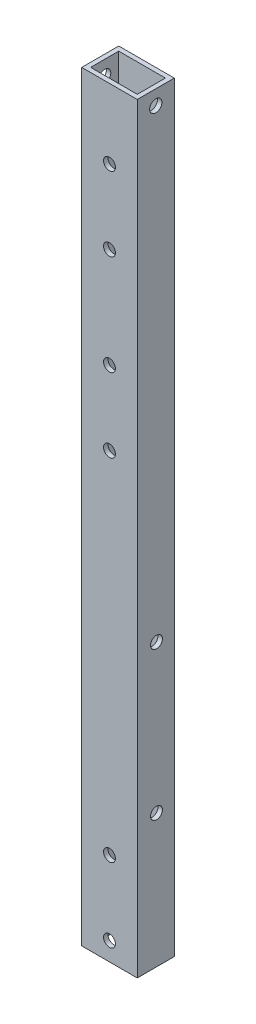
ISO-10303-21;
HEADER;
FILE_DESCRIPTION(('STEP AP214'),'2;1');
FILE_NAME('part.step','',(''),(''),'','','');
FILE_SCHEMA(('AUTOMOTIVE_DESIGN { 1 0 10303 214 1 1 1 1 }'));
ENDSEC;
DATA;
#1=APPLICATION_CONTEXT('core data for automotive mechanical design processes');
#2=APPLICATION_PROTOCOL_DEFINITION('international standard','automotive_design',2000,#1);
#3=PRODUCT_CONTEXT('',#1,'mechanical');
#4=PRODUCT('Part','Part','',(#3));
#5=PRODUCT_RELATED_PRODUCT_CATEGORY('part','',(#4));
#6=PRODUCT_DEFINITION_FORMATION('','',#4);
#7=PRODUCT_DEFINITION_CONTEXT('part definition',#1,'design');
#8=PRODUCT_DEFINITION('design','',#6,#7);
#9=PRODUCT_DEFINITION_SHAPE('','',#8);
#10=(LENGTH_UNIT() NAMED_UNIT(*) SI_UNIT(.MILLI.,.METRE.));
#11=(NAMED_UNIT(*) PLANE_ANGLE_UNIT() SI_UNIT($,.RADIAN.));
#12=(NAMED_UNIT(*) SI_UNIT($,.STERADIAN.) SOLID_ANGLE_UNIT());
#13=UNCERTAINTY_MEASURE_WITH_UNIT(LENGTH_MEASURE(1.E-05),#10,'distance_accuracy_value','');
#14=(GEOMETRIC_REPRESENTATION_CONTEXT(3) GLOBAL_UNCERTAINTY_ASSIGNED_CONTEXT((#13)) GLOBAL_UNIT_ASSIGNED_CONTEXT((#10,
#11,#12)) REPRESENTATION_CONTEXT('',''));
#15=CARTESIAN_POINT('',(0.,0.,0.));
#16=DIRECTION('',(0.,0.,1.));
#17=DIRECTION('',(1.,0.,0.));
#18=AXIS2_PLACEMENT_3D('',#15,#16,#17);
#19=CARTESIAN_POINT('',(7.5,110.,-5.));
#20=DIRECTION('',(-1.,0.,0.));
#21=DIRECTION('',(0.,0.,1.));
#22=AXIS2_PLACEMENT_3D('',#19,#20,#21);
#23=PLANE('',#22);
#24=CARTESIAN_POINT('',(7.5,91.5,0.));
#25=DIRECTION('',(-1.,0.,0.));
#26=DIRECTION('',(0.,0.,1.));
#27=AXIS2_PLACEMENT_3D('',#24,#25,#26);
#28=CIRCLE('',#27,1.65);
#29=CARTESIAN_POINT('',(7.5,91.5,1.64999999999995));
#30=VERTEX_POINT('',#29);
#31=EDGE_CURVE('E184',#30,#30,#28,.T.);
#32=ORIENTED_EDGE('',*,*,#31,.T.);
#33=EDGE_LOOP('',(#32));
#34=FACE_BOUND('',#33,.T.);
#35=CARTESIAN_POINT('',(7.5,-34.,-0.200000000000043));
#36=DIRECTION('',(-1.,0.,0.));
#37=DIRECTION('',(0.,0.,1.));
#38=AXIS2_PLACEMENT_3D('',#35,#36,#37);
#39=CIRCLE('',#38,1.6);
#40=CARTESIAN_POINT('',(7.5,-34.,1.39999999999995));
#41=VERTEX_POINT('',#40);
#42=EDGE_CURVE('E268',#41,#41,#39,.T.);
#43=ORIENTED_EDGE('',*,*,#42,.T.);
#44=EDGE_LOOP('',(#43));
#45=FACE_BOUND('',#44,.T.);
#46=CARTESIAN_POINT('',(7.5,-74.,-0.20000000000002));
#47=DIRECTION('',(-1.,0.,0.));
#48=DIRECTION('',(0.,0.,1.));
#49=AXIS2_PLACEMENT_3D('',#46,#47,#48);
#50=CIRCLE('',#49,1.60000000000001);
#51=CARTESIAN_POINT('',(7.5,-74.,1.39999999999999));
#52=VERTEX_POINT('',#51);
#53=EDGE_CURVE('E162',#52,#52,#50,.T.);
#54=ORIENTED_EDGE('',*,*,#53,.T.);
#55=EDGE_LOOP('',(#54));
#56=FACE_BOUND('',#55,.T.);
#57=DIRECTION('',(0.,0.,-1.));
#58=VECTOR('',#57,1.);
#59=CARTESIAN_POINT('',(7.5,95.5,5.));
#60=LINE('',#59,#58);
#61=CARTESIAN_POINT('',(7.5,95.5,5.));
#62=VERTEX_POINT('',#61);
#63=CARTESIAN_POINT('',(7.5,95.5,-5.));
#64=VERTEX_POINT('',#63);
#65=EDGE_CURVE('E110',#62,#64,#60,.T.);
#66=ORIENTED_EDGE('',*,*,#65,.F.);
#67=DIRECTION('',(0.,-1.,0.));
#68=VECTOR('',#67,1.);
#69=CARTESIAN_POINT('',(7.5,110.,5.));
#70=LINE('',#69,#68);
#71=CARTESIAN_POINT('',(7.5,-110.,5.));
#72=VERTEX_POINT('',#71);
#73=EDGE_CURVE('E121',#62,#72,#70,.T.);
#74=ORIENTED_EDGE('',*,*,#73,.T.);
#75=DIRECTION('',(0.,0.,-1.));
#76=VECTOR('',#75,1.);
#77=CARTESIAN_POINT('',(7.5,-110.,-5.));
#78=LINE('',#77,#76);
#79=CARTESIAN_POINT('',(7.5,-110.,-5.));
#80=VERTEX_POINT('',#79);
#81=EDGE_CURVE('E329',#72,#80,#78,.T.);
#82=ORIENTED_EDGE('',*,*,#81,.T.);
#83=DIRECTION('',(0.,-1.,0.));
#84=VECTOR('',#83,1.);
#85=CARTESIAN_POINT('',(7.5,110.,-5.));
#86=LINE('',#85,#84);
#87=EDGE_CURVE('E53',#64,#80,#86,.T.);
#88=ORIENTED_EDGE('',*,*,#87,.F.);
#89=EDGE_LOOP('',(#66,#74,#82,#88));
#90=FACE_BOUND('',#89,.T.);
#91=ADVANCED_FACE('F44',(#34,#45,#56,#90),#23,.F.);
#92=CARTESIAN_POINT('',(-7.5,110.,-5.));
#93=DIRECTION('',(0.,0.,1.));
#94=DIRECTION('',(1.,0.,0.));
#95=AXIS2_PLACEMENT_3D('',#92,#93,#94);
#96=PLANE('',#95);
#97=CARTESIAN_POINT('',(0.,9.60000000000003,-5.));
#98=DIRECTION('',(0.,0.,-1.));
#99=DIRECTION('',(-1.,0.,0.));
#100=AXIS2_PLACEMENT_3D('',#97,#98,#99);
#101=CIRCLE('',#100,1.6);
#102=CARTESIAN_POINT('',(-1.6,9.60000000000003,-5.));
#103=VERTEX_POINT('',#102);
#104=EDGE_CURVE('E197',#103,#103,#101,.T.);
#105=ORIENTED_EDGE('',*,*,#104,.F.);
#106=EDGE_LOOP('',(#105));
#107=FACE_BOUND('',#106,.T.);
#108=CARTESIAN_POINT('',(0.,29.6,-5.));
#109=DIRECTION('',(0.,0.,-1.));
#110=DIRECTION('',(-1.,0.,0.));
#111=AXIS2_PLACEMENT_3D('',#108,#109,#110);
#112=CIRCLE('',#111,1.6);
#113=CARTESIAN_POINT('',(-1.59999999999999,29.6,-5.));
#114=VERTEX_POINT('',#113);
#115=EDGE_CURVE('E203',#114,#114,#112,.T.);
#116=ORIENTED_EDGE('',*,*,#115,.F.);
#117=EDGE_LOOP('',(#116));
#118=FACE_BOUND('',#117,.T.);
#119=CARTESIAN_POINT('',(0.,56.66,-5.));
#120=DIRECTION('',(0.,0.,-1.));
#121=DIRECTION('',(-1.,0.,0.));
#122=AXIS2_PLACEMENT_3D('',#119,#120,#121);
#123=CIRCLE('',#122,1.6);
#124=CARTESIAN_POINT('',(-1.6,56.66,-5.));
#125=VERTEX_POINT('',#124);
#126=EDGE_CURVE('E173',#125,#125,#123,.T.);
#127=ORIENTED_EDGE('',*,*,#126,.F.);
#128=EDGE_LOOP('',(#127));
#129=FACE_BOUND('',#128,.T.);
#130=CARTESIAN_POINT('',(0.,76.66,-5.));
#131=DIRECTION('',(0.,0.,-1.));
#132=DIRECTION('',(-1.,0.,0.));
#133=AXIS2_PLACEMENT_3D('',#130,#131,#132);
#134=CIRCLE('',#133,1.6);
#135=CARTESIAN_POINT('',(-1.6,76.66,-5.));
#136=VERTEX_POINT('',#135);
#137=EDGE_CURVE('E227',#136,#136,#134,.T.);
#138=ORIENTED_EDGE('',*,*,#137,.F.);
#139=EDGE_LOOP('',(#138));
#140=FACE_BOUND('',#139,.T.);
#141=CARTESIAN_POINT('',(0.,-105.,-5.));
#142=DIRECTION('',(0.,0.,-1.));
#143=DIRECTION('',(-1.,0.,0.));
#144=AXIS2_PLACEMENT_3D('',#141,#142,#143);
#145=CIRCLE('',#144,1.60000000000001);
#146=CARTESIAN_POINT('',(-1.60000000000001,-105.,-5.));
#147=VERTEX_POINT('',#146);
#148=EDGE_CURVE('E281',#147,#147,#145,.T.);
#149=ORIENTED_EDGE('',*,*,#148,.F.);
#150=EDGE_LOOP('',(#149));
#151=FACE_BOUND('',#150,.T.);
#152=CARTESIAN_POINT('',(0.,-85.,-5.));
#153=DIRECTION('',(0.,0.,-1.));
#154=DIRECTION('',(-1.,0.,0.));
#155=AXIS2_PLACEMENT_3D('',#152,#153,#154);
#156=CIRCLE('',#155,1.6);
#157=CARTESIAN_POINT('',(-1.6,-85.,-5.));
#158=VERTEX_POINT('',#157);
#159=EDGE_CURVE('E150',#158,#158,#156,.T.);
#160=ORIENTED_EDGE('',*,*,#159,.F.);
#161=EDGE_LOOP('',(#160));
#162=FACE_BOUND('',#161,.T.);
#163=DIRECTION('',(-1.,0.,0.));
#164=VECTOR('',#163,1.);
#165=CARTESIAN_POINT('',(7.5,95.5,-5.));
#166=LINE('',#165,#164);
#167=CARTESIAN_POINT('',(-7.5,95.5,-5.));
#168=VERTEX_POINT('',#167);
#169=EDGE_CURVE('E124',#64,#168,#166,.T.);
#170=ORIENTED_EDGE('',*,*,#169,.F.);
#171=ORIENTED_EDGE('',*,*,#87,.T.);
#172=DIRECTION('',(-1.,0.,0.));
#173=VECTOR('',#172,1.);
#174=CARTESIAN_POINT('',(-7.5,-110.,-5.));
#175=LINE('',#174,#173);
#176=CARTESIAN_POINT('',(-7.5,-110.,-5.));
#177=VERTEX_POINT('',#176);
#178=EDGE_CURVE('E332',#80,#177,#175,.T.);
#179=ORIENTED_EDGE('',*,*,#178,.T.);
#180=DIRECTION('',(0.,-1.,0.));
#181=VECTOR('',#180,1.);
#182=CARTESIAN_POINT('',(-7.5,110.,-5.));
#183=LINE('',#182,#181);
#184=EDGE_CURVE('E135',#168,#177,#183,.T.);
#185=ORIENTED_EDGE('',*,*,#184,.F.);
#186=EDGE_LOOP('',(#170,#171,#179,#185));
#187=FACE_BOUND('',#186,.T.);
#188=ADVANCED_FACE('F346',(#107,#118,#129,#140,#151,#162,#187),#96,.F.);
#189=CARTESIAN_POINT('',(-7.5,110.,-5.));
#190=DIRECTION('',(1.,0.,0.));
#191=DIRECTION('',(0.,0.,-1.));
#192=AXIS2_PLACEMENT_3D('',#189,#190,#191);
#193=PLANE('',#192);
#194=CARTESIAN_POINT('',(-7.5,91.5,0.));
#195=DIRECTION('',(-1.,0.,0.));
#196=DIRECTION('',(0.,0.,1.));
#197=AXIS2_PLACEMENT_3D('',#194,#195,#196);
#198=CIRCLE('',#197,1.65);
#199=CARTESIAN_POINT('',(-7.5,91.5,1.64999999999995));
#200=VERTEX_POINT('',#199);
#201=EDGE_CURVE('E217',#200,#200,#198,.T.);
#202=ORIENTED_EDGE('',*,*,#201,.F.);
#203=EDGE_LOOP('',(#202));
#204=FACE_BOUND('',#203,.T.);
#205=CARTESIAN_POINT('',(-7.5,-34.,-0.200000000000042));
#206=DIRECTION('',(-1.,0.,0.));
#207=DIRECTION('',(0.,0.,1.));
#208=AXIS2_PLACEMENT_3D('',#205,#206,#207);
#209=CIRCLE('',#208,1.6);
#210=CARTESIAN_POINT('',(-7.5,-34.,1.39999999999995));
#211=VERTEX_POINT('',#210);
#212=EDGE_CURVE('E260',#211,#211,#209,.T.);
#213=ORIENTED_EDGE('',*,*,#212,.F.);
#214=EDGE_LOOP('',(#213));
#215=FACE_BOUND('',#214,.T.);
#216=CARTESIAN_POINT('',(-7.5,-74.,-0.200000000000019));
#217=DIRECTION('',(-1.,0.,0.));
#218=DIRECTION('',(0.,0.,1.));
#219=AXIS2_PLACEMENT_3D('',#216,#217,#218);
#220=CIRCLE('',#219,1.60000000000001);
#221=CARTESIAN_POINT('',(-7.5,-74.,1.39999999999999));
#222=VERTEX_POINT('',#221);
#223=EDGE_CURVE('E264',#222,#222,#220,.T.);
#224=ORIENTED_EDGE('',*,*,#223,.F.);
#225=EDGE_LOOP('',(#224));
#226=FACE_BOUND('',#225,.T.);
#227=DIRECTION('',(0.,0.,1.));
#228=VECTOR('',#227,1.);
#229=CARTESIAN_POINT('',(-7.5,95.5,-5.));
#230=LINE('',#229,#228);
#231=CARTESIAN_POINT('',(-7.5,95.5,5.));
#232=VERTEX_POINT('',#231);
#233=EDGE_CURVE('E61',#168,#232,#230,.T.);
#234=ORIENTED_EDGE('',*,*,#233,.F.);
#235=ORIENTED_EDGE('',*,*,#184,.T.);
#236=DIRECTION('',(0.,0.,1.));
#237=VECTOR('',#236,1.);
#238=CARTESIAN_POINT('',(-7.5,-110.,-5.));
#239=LINE('',#238,#237);
#240=CARTESIAN_POINT('',(-7.5,-110.,5.));
#241=VERTEX_POINT('',#240);
#242=EDGE_CURVE('E137',#177,#241,#239,.T.);
#243=ORIENTED_EDGE('',*,*,#242,.T.);
#244=DIRECTION('',(0.,-1.,0.));
#245=VECTOR('',#244,1.);
#246=CARTESIAN_POINT('',(-7.5,110.,5.));
#247=LINE('',#246,#245);
#248=EDGE_CURVE('E131',#232,#241,#247,.T.);
#249=ORIENTED_EDGE('',*,*,#248,.F.);
#250=EDGE_LOOP('',(#234,#235,#243,#249));
#251=FACE_BOUND('',#250,.T.);
#252=ADVANCED_FACE('F339',(#204,#215,#226,#251),#193,.F.);
#253=CARTESIAN_POINT('',(-7.5,110.,5.));
#254=DIRECTION('',(0.,0.,-1.));
#255=DIRECTION('',(-1.,0.,0.));
#256=AXIS2_PLACEMENT_3D('',#253,#254,#255);
#257=PLANE('',#256);
#258=CARTESIAN_POINT('',(0.,9.60000000000003,5.));
#259=DIRECTION('',(0.,0.,-1.));
#260=DIRECTION('',(-1.,0.,0.));
#261=AXIS2_PLACEMENT_3D('',#258,#259,#260);
#262=CIRCLE('',#261,1.6);
#263=CARTESIAN_POINT('',(-1.6,9.60000000000003,5.));
#264=VERTEX_POINT('',#263);
#265=EDGE_CURVE('E189',#264,#264,#262,.T.);
#266=ORIENTED_EDGE('',*,*,#265,.T.);
#267=EDGE_LOOP('',(#266));
#268=FACE_BOUND('',#267,.T.);
#269=CARTESIAN_POINT('',(0.,29.6,5.));
#270=DIRECTION('',(0.,0.,-1.));
#271=DIRECTION('',(-1.,0.,0.));
#272=AXIS2_PLACEMENT_3D('',#269,#270,#271);
#273=CIRCLE('',#272,1.6);
#274=CARTESIAN_POINT('',(-1.59999999999999,29.6,5.));
#275=VERTEX_POINT('',#274);
#276=EDGE_CURVE('E209',#275,#275,#273,.T.);
#277=ORIENTED_EDGE('',*,*,#276,.T.);
#278=EDGE_LOOP('',(#277));
#279=FACE_BOUND('',#278,.T.);
#280=CARTESIAN_POINT('',(0.,56.66,5.));
#281=DIRECTION('',(0.,0.,-1.));
#282=DIRECTION('',(-1.,0.,0.));
#283=AXIS2_PLACEMENT_3D('',#280,#281,#282);
#284=CIRCLE('',#283,1.6);
#285=CARTESIAN_POINT('',(-1.6,56.66,5.));
#286=VERTEX_POINT('',#285);
#287=EDGE_CURVE('E116',#286,#286,#284,.T.);
#288=ORIENTED_EDGE('',*,*,#287,.T.);
#289=EDGE_LOOP('',(#288));
#290=FACE_BOUND('',#289,.T.);
#291=CARTESIAN_POINT('',(0.,76.66,5.));
#292=DIRECTION('',(0.,0.,-1.));
#293=DIRECTION('',(-1.,0.,0.));
#294=AXIS2_PLACEMENT_3D('',#291,#292,#293);
#295=CIRCLE('',#294,1.6);
#296=CARTESIAN_POINT('',(-1.6,76.66,5.));
#297=VERTEX_POINT('',#296);
#298=EDGE_CURVE('E179',#297,#297,#295,.T.);
#299=ORIENTED_EDGE('',*,*,#298,.T.);
#300=EDGE_LOOP('',(#299));
#301=FACE_BOUND('',#300,.T.);
#302=CARTESIAN_POINT('',(0.,-105.,5.));
#303=DIRECTION('',(0.,0.,-1.));
#304=DIRECTION('',(-1.,0.,0.));
#305=AXIS2_PLACEMENT_3D('',#302,#303,#304);
#306=CIRCLE('',#305,1.60000000000001);
#307=CARTESIAN_POINT('',(-1.60000000000001,-105.,5.));
#308=VERTEX_POINT('',#307);
#309=EDGE_CURVE('E156',#308,#308,#306,.T.);
#310=ORIENTED_EDGE('',*,*,#309,.T.);
#311=EDGE_LOOP('',(#310));
#312=FACE_BOUND('',#311,.T.);
#313=CARTESIAN_POINT('',(0.,-85.,5.));
#314=DIRECTION('',(0.,0.,-1.));
#315=DIRECTION('',(-1.,0.,0.));
#316=AXIS2_PLACEMENT_3D('',#313,#314,#315);
#317=CIRCLE('',#316,1.6);
#318=CARTESIAN_POINT('',(-1.6,-85.,5.));
#319=VERTEX_POINT('',#318);
#320=EDGE_CURVE('E297',#319,#319,#317,.T.);
#321=ORIENTED_EDGE('',*,*,#320,.T.);
#322=EDGE_LOOP('',(#321));
#323=FACE_BOUND('',#322,.T.);
#324=DIRECTION('',(1.,0.,0.));
#325=VECTOR('',#324,1.);
#326=CARTESIAN_POINT('',(-7.5,95.5,5.));
#327=LINE('',#326,#325);
#328=EDGE_CURVE('E107',#232,#62,#327,.T.);
#329=ORIENTED_EDGE('',*,*,#328,.F.);
#330=ORIENTED_EDGE('',*,*,#248,.T.);
#331=DIRECTION('',(1.,0.,0.));
#332=VECTOR('',#331,1.);
#333=CARTESIAN_POINT('',(-7.5,-110.,5.));
#334=LINE('',#333,#332);
#335=EDGE_CURVE('E128',#241,#72,#334,.T.);
#336=ORIENTED_EDGE('',*,*,#335,.T.);
#337=ORIENTED_EDGE('',*,*,#73,.F.);
#338=EDGE_LOOP('',(#329,#330,#336,#337));
#339=FACE_BOUND('',#338,.T.);
#340=ADVANCED_FACE('F126',(#268,#279,#290,#301,#312,#323,#339),#257,.F.);
#341=CARTESIAN_POINT('',(-6.3,110.,-3.8));
#342=DIRECTION('',(1.,0.,0.));
#343=DIRECTION('',(0.,0.,-1.));
#344=AXIS2_PLACEMENT_3D('',#341,#342,#343);
#345=PLANE('',#344);
#346=CARTESIAN_POINT('',(-6.3,91.5,0.));
#347=DIRECTION('',(1.,0.,0.));
#348=DIRECTION('',(0.,0.,-1.));
#349=AXIS2_PLACEMENT_3D('',#346,#347,#348);
#350=CIRCLE('',#349,1.65);
#351=CARTESIAN_POINT('',(-6.3,91.5,-1.65000000000005));
#352=VERTEX_POINT('',#351);
#353=EDGE_CURVE('E183',#352,#352,#350,.T.);
#354=ORIENTED_EDGE('',*,*,#353,.F.);
#355=EDGE_LOOP('',(#354));
#356=FACE_BOUND('',#355,.T.);
#357=CARTESIAN_POINT('',(-6.3,-74.,-0.200000000000019));
#358=DIRECTION('',(1.,0.,0.));
#359=DIRECTION('',(0.,0.,-1.));
#360=AXIS2_PLACEMENT_3D('',#357,#358,#359);
#361=CIRCLE('',#360,1.60000000000001);
#362=CARTESIAN_POINT('',(-6.3,-74.,-1.80000000000003));
#363=VERTEX_POINT('',#362);
#364=EDGE_CURVE('E166',#363,#363,#361,.T.);
#365=ORIENTED_EDGE('',*,*,#364,.F.);
#366=EDGE_LOOP('',(#365));
#367=FACE_BOUND('',#366,.T.);
#368=CARTESIAN_POINT('',(-6.3,-34.,-0.200000000000042));
#369=DIRECTION('',(1.,0.,0.));
#370=DIRECTION('',(0.,0.,-1.));
#371=AXIS2_PLACEMENT_3D('',#368,#369,#370);
#372=CIRCLE('',#371,1.6);
#373=CARTESIAN_POINT('',(-6.3,-34.,-1.80000000000004));
#374=VERTEX_POINT('',#373);
#375=EDGE_CURVE('E161',#374,#374,#372,.T.);
#376=ORIENTED_EDGE('',*,*,#375,.F.);
#377=EDGE_LOOP('',(#376));
#378=FACE_BOUND('',#377,.T.);
#379=DIRECTION('',(0.,-1.,0.));
#380=VECTOR('',#379,1.);
#381=CARTESIAN_POINT('',(-6.3,110.,-3.8));
#382=LINE('',#381,#380);
#383=CARTESIAN_POINT('',(-6.3,95.5,-3.8));
#384=VERTEX_POINT('',#383);
#385=CARTESIAN_POINT('',(-6.3,-110.,-3.8));
#386=VERTEX_POINT('',#385);
#387=EDGE_CURVE('E317',#384,#386,#382,.T.);
#388=ORIENTED_EDGE('',*,*,#387,.F.);
#389=DIRECTION('',(0.,0.,1.));
#390=VECTOR('',#389,1.);
#391=CARTESIAN_POINT('',(-6.3,95.5,-3.8));
#392=LINE('',#391,#390);
#393=CARTESIAN_POINT('',(-6.3,95.5,3.8));
#394=VERTEX_POINT('',#393);
#395=EDGE_CURVE('E69',#384,#394,#392,.T.);
#396=ORIENTED_EDGE('',*,*,#395,.T.);
#397=DIRECTION('',(0.,-1.,0.));
#398=VECTOR('',#397,1.);
#399=CARTESIAN_POINT('',(-6.3,110.,3.8));
#400=LINE('',#399,#398);
#401=CARTESIAN_POINT('',(-6.3,-110.,3.8));
#402=VERTEX_POINT('',#401);
#403=EDGE_CURVE('E326',#394,#402,#400,.T.);
#404=ORIENTED_EDGE('',*,*,#403,.T.);
#405=DIRECTION('',(0.,0.,1.));
#406=VECTOR('',#405,1.);
#407=CARTESIAN_POINT('',(-6.3,-110.,-3.8));
#408=LINE('',#407,#406);
#409=EDGE_CURVE('E301',#386,#402,#408,.T.);
#410=ORIENTED_EDGE('',*,*,#409,.F.);
#411=EDGE_LOOP('',(#388,#396,#404,#410));
#412=FACE_BOUND('',#411,.T.);
#413=ADVANCED_FACE('F362',(#356,#367,#378,#412),#345,.T.);
#414=CARTESIAN_POINT('',(-6.3,110.,3.8));
#415=DIRECTION('',(0.,0.,-1.));
#416=DIRECTION('',(-1.,0.,0.));
#417=AXIS2_PLACEMENT_3D('',#414,#415,#416);
#418=PLANE('',#417);
#419=CARTESIAN_POINT('',(0.,9.60000000000003,3.8));
#420=DIRECTION('',(0.,0.,-1.));
#421=DIRECTION('',(-1.,0.,0.));
#422=AXIS2_PLACEMENT_3D('',#419,#420,#421);
#423=CIRCLE('',#422,1.6);
#424=CARTESIAN_POINT('',(-1.6,9.60000000000003,3.8));
#425=VERTEX_POINT('',#424);
#426=EDGE_CURVE('E213',#425,#425,#423,.T.);
#427=ORIENTED_EDGE('',*,*,#426,.F.);
#428=EDGE_LOOP('',(#427));
#429=FACE_BOUND('',#428,.T.);
#430=CARTESIAN_POINT('',(0.,29.6,3.8));
#431=DIRECTION('',(0.,0.,-1.));
#432=DIRECTION('',(-1.,0.,0.));
#433=AXIS2_PLACEMENT_3D('',#430,#431,#432);
#434=CIRCLE('',#433,1.6);
#435=CARTESIAN_POINT('',(-1.59999999999999,29.6,3.8));
#436=VERTEX_POINT('',#435);
#437=EDGE_CURVE('E188',#436,#436,#434,.T.);
#438=ORIENTED_EDGE('',*,*,#437,.F.);
#439=EDGE_LOOP('',(#438));
#440=FACE_BOUND('',#439,.T.);
#441=CARTESIAN_POINT('',(0.,56.66,3.8));
#442=DIRECTION('',(0.,0.,-1.));
#443=DIRECTION('',(-1.,0.,0.));
#444=AXIS2_PLACEMENT_3D('',#441,#442,#443);
#445=CIRCLE('',#444,1.6);
#446=CARTESIAN_POINT('',(-1.6,56.66,3.8));
#447=VERTEX_POINT('',#446);
#448=EDGE_CURVE('E178',#447,#447,#445,.T.);
#449=ORIENTED_EDGE('',*,*,#448,.F.);
#450=EDGE_LOOP('',(#449));
#451=FACE_BOUND('',#450,.T.);
#452=CARTESIAN_POINT('',(0.,76.66,3.8));
#453=DIRECTION('',(0.,0.,-1.));
#454=DIRECTION('',(-1.,0.,0.));
#455=AXIS2_PLACEMENT_3D('',#452,#453,#454);
#456=CIRCLE('',#455,1.6);
#457=CARTESIAN_POINT('',(-1.6,76.66,3.8));
#458=VERTEX_POINT('',#457);
#459=EDGE_CURVE('E172',#458,#458,#456,.T.);
#460=ORIENTED_EDGE('',*,*,#459,.F.);
#461=EDGE_LOOP('',(#460));
#462=FACE_BOUND('',#461,.T.);
#463=CARTESIAN_POINT('',(0.,-85.,3.8));
#464=DIRECTION('',(0.,0.,-1.));
#465=DIRECTION('',(-1.,0.,0.));
#466=AXIS2_PLACEMENT_3D('',#463,#464,#465);
#467=CIRCLE('',#466,1.6);
#468=CARTESIAN_POINT('',(-1.6,-85.,3.8));
#469=VERTEX_POINT('',#468);
#470=EDGE_CURVE('E155',#469,#469,#467,.T.);
#471=ORIENTED_EDGE('',*,*,#470,.F.);
#472=EDGE_LOOP('',(#471));
#473=FACE_BOUND('',#472,.T.);
#474=CARTESIAN_POINT('',(0.,-105.,3.8));
#475=DIRECTION('',(0.,0.,-1.));
#476=DIRECTION('',(-1.,0.,0.));
#477=AXIS2_PLACEMENT_3D('',#474,#475,#476);
#478=CIRCLE('',#477,1.60000000000001);
#479=CARTESIAN_POINT('',(-1.60000000000001,-105.,3.8));
#480=VERTEX_POINT('',#479);
#481=EDGE_CURVE('E149',#480,#480,#478,.T.);
#482=ORIENTED_EDGE('',*,*,#481,.F.);
#483=EDGE_LOOP('',(#482));
#484=FACE_BOUND('',#483,.T.);
#485=ORIENTED_EDGE('',*,*,#403,.F.);
#486=DIRECTION('',(1.,0.,0.));
#487=VECTOR('',#486,1.);
#488=CARTESIAN_POINT('',(-6.3,95.5,3.8));
#489=LINE('',#488,#487);
#490=CARTESIAN_POINT('',(6.3,95.5,3.8));
#491=VERTEX_POINT('',#490);
#492=EDGE_CURVE('E254',#394,#491,#489,.T.);
#493=ORIENTED_EDGE('',*,*,#492,.T.);
#494=DIRECTION('',(0.,-1.,0.));
#495=VECTOR('',#494,1.);
#496=CARTESIAN_POINT('',(6.3,110.,3.8));
#497=LINE('',#496,#495);
#498=CARTESIAN_POINT('',(6.3,-110.,3.8));
#499=VERTEX_POINT('',#498);
#500=EDGE_CURVE('E323',#491,#499,#497,.T.);
#501=ORIENTED_EDGE('',*,*,#500,.T.);
#502=DIRECTION('',(1.,0.,0.));
#503=VECTOR('',#502,1.);
#504=CARTESIAN_POINT('',(-6.3,-110.,3.8));
#505=LINE('',#504,#503);
#506=EDGE_CURVE('E305',#402,#499,#505,.T.);
#507=ORIENTED_EDGE('',*,*,#506,.F.);
#508=EDGE_LOOP('',(#485,#493,#501,#507));
#509=FACE_BOUND('',#508,.T.);
#510=ADVANCED_FACE('F369',(#429,#440,#451,#462,#473,#484,#509),#418,.T.);
#511=CARTESIAN_POINT('',(6.3,110.,-3.8));
#512=DIRECTION('',(-1.,0.,0.));
#513=DIRECTION('',(0.,0.,1.));
#514=AXIS2_PLACEMENT_3D('',#511,#512,#513);
#515=PLANE('',#514);
#516=CARTESIAN_POINT('',(6.3,91.5,0.));
#517=DIRECTION('',(-1.,0.,0.));
#518=DIRECTION('',(0.,0.,1.));
#519=AXIS2_PLACEMENT_3D('',#516,#517,#518);
#520=CIRCLE('',#519,1.65);
#521=CARTESIAN_POINT('',(6.3,91.5,1.64999999999995));
#522=VERTEX_POINT('',#521);
#523=EDGE_CURVE('E180',#522,#522,#520,.T.);
#524=ORIENTED_EDGE('',*,*,#523,.F.);
#525=EDGE_LOOP('',(#524));
#526=FACE_BOUND('',#525,.T.);
#527=CARTESIAN_POINT('',(6.3,-74.,-0.20000000000002));
#528=DIRECTION('',(-1.,0.,0.));
#529=DIRECTION('',(0.,0.,1.));
#530=AXIS2_PLACEMENT_3D('',#527,#528,#529);
#531=CIRCLE('',#530,1.60000000000001);
#532=CARTESIAN_POINT('',(6.3,-74.,1.39999999999999));
#533=VERTEX_POINT('',#532);
#534=EDGE_CURVE('E163',#533,#533,#531,.T.);
#535=ORIENTED_EDGE('',*,*,#534,.F.);
#536=EDGE_LOOP('',(#535));
#537=FACE_BOUND('',#536,.T.);
#538=CARTESIAN_POINT('',(6.3,-34.,-0.200000000000043));
#539=DIRECTION('',(-1.,0.,0.));
#540=DIRECTION('',(0.,0.,1.));
#541=AXIS2_PLACEMENT_3D('',#538,#539,#540);
#542=CIRCLE('',#541,1.6);
#543=CARTESIAN_POINT('',(6.3,-34.,1.39999999999995));
#544=VERTEX_POINT('',#543);
#545=EDGE_CURVE('E157',#544,#544,#542,.T.);
#546=ORIENTED_EDGE('',*,*,#545,.F.);
#547=EDGE_LOOP('',(#546));
#548=FACE_BOUND('',#547,.T.);
#549=ORIENTED_EDGE('',*,*,#500,.F.);
#550=DIRECTION('',(0.,0.,-1.));
#551=VECTOR('',#550,1.);
#552=CARTESIAN_POINT('',(6.3,95.5,-3.8));
#553=LINE('',#552,#551);
#554=CARTESIAN_POINT('',(6.3,95.5,-3.8));
#555=VERTEX_POINT('',#554);
#556=EDGE_CURVE('E250',#491,#555,#553,.T.);
#557=ORIENTED_EDGE('',*,*,#556,.T.);
#558=DIRECTION('',(0.,-1.,0.));
#559=VECTOR('',#558,1.);
#560=CARTESIAN_POINT('',(6.3,110.,-3.8));
#561=LINE('',#560,#559);
#562=CARTESIAN_POINT('',(6.3,-110.,-3.8));
#563=VERTEX_POINT('',#562);
#564=EDGE_CURVE('E320',#555,#563,#561,.T.);
#565=ORIENTED_EDGE('',*,*,#564,.T.);
#566=DIRECTION('',(0.,0.,-1.));
#567=VECTOR('',#566,1.);
#568=CARTESIAN_POINT('',(6.3,-110.,-3.8));
#569=LINE('',#568,#567);
#570=EDGE_CURVE('E309',#499,#563,#569,.T.);
#571=ORIENTED_EDGE('',*,*,#570,.F.);
#572=EDGE_LOOP('',(#549,#557,#565,#571));
#573=FACE_BOUND('',#572,.T.);
#574=ADVANCED_FACE('F373',(#526,#537,#548,#573),#515,.T.);
#575=CARTESIAN_POINT('',(-6.3,110.,-3.8));
#576=DIRECTION('',(0.,0.,1.));
#577=DIRECTION('',(1.,0.,0.));
#578=AXIS2_PLACEMENT_3D('',#575,#576,#577);
#579=PLANE('',#578);
#580=CARTESIAN_POINT('',(0.,9.60000000000003,-3.8));
#581=DIRECTION('',(0.,0.,1.));
#582=DIRECTION('',(1.,0.,0.));
#583=AXIS2_PLACEMENT_3D('',#580,#581,#582);
#584=CIRCLE('',#583,1.6);
#585=CARTESIAN_POINT('',(1.6,9.60000000000003,-3.8));
#586=VERTEX_POINT('',#585);
#587=EDGE_CURVE('E47',#586,#586,#584,.T.);
#588=ORIENTED_EDGE('',*,*,#587,.F.);
#589=EDGE_LOOP('',(#588));
#590=FACE_BOUND('',#589,.T.);
#591=CARTESIAN_POINT('',(0.,29.6,-3.8));
#592=DIRECTION('',(0.,0.,1.));
#593=DIRECTION('',(1.,0.,0.));
#594=AXIS2_PLACEMENT_3D('',#591,#592,#593);
#595=CIRCLE('',#594,1.6);
#596=CARTESIAN_POINT('',(1.60000000000002,29.6,-3.8));
#597=VERTEX_POINT('',#596);
#598=EDGE_CURVE('E185',#597,#597,#595,.T.);
#599=ORIENTED_EDGE('',*,*,#598,.F.);
#600=EDGE_LOOP('',(#599));
#601=FACE_BOUND('',#600,.T.);
#602=CARTESIAN_POINT('',(0.,56.66,-3.8));
#603=DIRECTION('',(0.,0.,1.));
#604=DIRECTION('',(1.,0.,0.));
#605=AXIS2_PLACEMENT_3D('',#602,#603,#604);
#606=CIRCLE('',#605,1.6);
#607=CARTESIAN_POINT('',(1.6,56.66,-3.8));
#608=VERTEX_POINT('',#607);
#609=EDGE_CURVE('E174',#608,#608,#606,.T.);
#610=ORIENTED_EDGE('',*,*,#609,.F.);
#611=EDGE_LOOP('',(#610));
#612=FACE_BOUND('',#611,.T.);
#613=CARTESIAN_POINT('',(0.,76.66,-3.8));
#614=DIRECTION('',(0.,0.,1.));
#615=DIRECTION('',(1.,0.,0.));
#616=AXIS2_PLACEMENT_3D('',#613,#614,#615);
#617=CIRCLE('',#616,1.6);
#618=CARTESIAN_POINT('',(1.6,76.66,-3.8));
#619=VERTEX_POINT('',#618);
#620=EDGE_CURVE('E168',#619,#619,#617,.T.);
#621=ORIENTED_EDGE('',*,*,#620,.F.);
#622=EDGE_LOOP('',(#621));
#623=FACE_BOUND('',#622,.T.);
#624=CARTESIAN_POINT('',(0.,-85.,-3.8));
#625=DIRECTION('',(0.,0.,1.));
#626=DIRECTION('',(1.,0.,0.));
#627=AXIS2_PLACEMENT_3D('',#624,#625,#626);
#628=CIRCLE('',#627,1.6);
#629=CARTESIAN_POINT('',(1.6,-85.,-3.8));
#630=VERTEX_POINT('',#629);
#631=EDGE_CURVE('E151',#630,#630,#628,.T.);
#632=ORIENTED_EDGE('',*,*,#631,.F.);
#633=EDGE_LOOP('',(#632));
#634=FACE_BOUND('',#633,.T.);
#635=CARTESIAN_POINT('',(0.,-105.,-3.8));
#636=DIRECTION('',(0.,0.,1.));
#637=DIRECTION('',(1.,0.,0.));
#638=AXIS2_PLACEMENT_3D('',#635,#636,#637);
#639=CIRCLE('',#638,1.60000000000001);
#640=CARTESIAN_POINT('',(1.60000000000001,-105.,-3.8));
#641=VERTEX_POINT('',#640);
#642=EDGE_CURVE('E145',#641,#641,#639,.T.);
#643=ORIENTED_EDGE('',*,*,#642,.F.);
#644=EDGE_LOOP('',(#643));
#645=FACE_BOUND('',#644,.T.);
#646=ORIENTED_EDGE('',*,*,#564,.F.);
#647=DIRECTION('',(-1.,0.,0.));
#648=VECTOR('',#647,1.);
#649=CARTESIAN_POINT('',(-6.3,95.5,-3.8));
#650=LINE('',#649,#648);
#651=EDGE_CURVE('E11',#555,#384,#650,.T.);
#652=ORIENTED_EDGE('',*,*,#651,.T.);
#653=ORIENTED_EDGE('',*,*,#387,.T.);
#654=DIRECTION('',(-1.,0.,0.));
#655=VECTOR('',#654,1.);
#656=CARTESIAN_POINT('',(-6.3,-110.,-3.8));
#657=LINE('',#656,#655);
#658=EDGE_CURVE('E313',#563,#386,#657,.T.);
#659=ORIENTED_EDGE('',*,*,#658,.F.);
#660=EDGE_LOOP('',(#646,#652,#653,#659));
#661=FACE_BOUND('',#660,.T.);
#662=ADVANCED_FACE('F366',(#590,#601,#612,#623,#634,#645,#661),#579,.T.);
#663=CARTESIAN_POINT('',(0.,-110.,0.));
#664=DIRECTION('',(0.,1.,0.));
#665=DIRECTION('',(0.,0.,1.));
#666=AXIS2_PLACEMENT_3D('',#663,#664,#665);
#667=PLANE('',#666);
#668=ORIENTED_EDGE('',*,*,#81,.F.);
#669=ORIENTED_EDGE('',*,*,#335,.F.);
#670=ORIENTED_EDGE('',*,*,#242,.F.);
#671=ORIENTED_EDGE('',*,*,#178,.F.);
#672=EDGE_LOOP('',(#668,#669,#670,#671));
#673=FACE_BOUND('',#672,.T.);
#674=ORIENTED_EDGE('',*,*,#409,.T.);
#675=ORIENTED_EDGE('',*,*,#506,.T.);
#676=ORIENTED_EDGE('',*,*,#570,.T.);
#677=ORIENTED_EDGE('',*,*,#658,.T.);
#678=EDGE_LOOP('',(#674,#675,#676,#677));
#679=FACE_BOUND('',#678,.T.);
#680=ADVANCED_FACE('F343',(#673,#679),#667,.F.);
#681=CARTESIAN_POINT('',(0.,-105.,95.));
#682=DIRECTION('',(0.,0.,-1.));
#683=DIRECTION('',(-1.,0.,0.));
#684=AXIS2_PLACEMENT_3D('',#681,#682,#683);
#685=CYLINDRICAL_SURFACE('',#684,1.60000000000001);
#686=ORIENTED_EDGE('',*,*,#642,.T.);
#687=EDGE_LOOP('',(#686));
#688=FACE_BOUND('',#687,.T.);
#689=ORIENTED_EDGE('',*,*,#148,.T.);
#690=EDGE_LOOP('',(#689));
#691=FACE_BOUND('',#690,.T.);
#692=ADVANCED_FACE('F365',(#688,#691),#685,.F.);
#693=CARTESIAN_POINT('',(0.,-85.,95.));
#694=DIRECTION('',(0.,0.,-1.));
#695=DIRECTION('',(-1.,0.,0.));
#696=AXIS2_PLACEMENT_3D('',#693,#694,#695);
#697=CYLINDRICAL_SURFACE('',#696,1.6);
#698=ORIENTED_EDGE('',*,*,#631,.T.);
#699=EDGE_LOOP('',(#698));
#700=FACE_BOUND('',#699,.T.);
#701=ORIENTED_EDGE('',*,*,#159,.T.);
#702=EDGE_LOOP('',(#701));
#703=FACE_BOUND('',#702,.T.);
#704=ADVANCED_FACE('F383',(#700,#703),#697,.F.);
#705=ORIENTED_EDGE('',*,*,#481,.T.);
#706=EDGE_LOOP('',(#705));
#707=FACE_BOUND('',#706,.T.);
#708=ORIENTED_EDGE('',*,*,#309,.F.);
#709=EDGE_LOOP('',(#708));
#710=FACE_BOUND('',#709,.T.);
#711=ADVANCED_FACE('F385',(#707,#710),#685,.F.);
#712=ORIENTED_EDGE('',*,*,#470,.T.);
#713=EDGE_LOOP('',(#712));
#714=FACE_BOUND('',#713,.T.);
#715=ORIENTED_EDGE('',*,*,#320,.F.);
#716=EDGE_LOOP('',(#715));
#717=FACE_BOUND('',#716,.T.);
#718=ADVANCED_FACE('F389',(#714,#717),#697,.F.);
#719=CARTESIAN_POINT('',(7.5,-34.,-0.200000000000043));
#720=DIRECTION('',(-1.,0.,0.));
#721=DIRECTION('',(0.,0.,1.));
#722=AXIS2_PLACEMENT_3D('',#719,#720,#721);
#723=CYLINDRICAL_SURFACE('',#722,1.6);
#724=ORIENTED_EDGE('',*,*,#545,.T.);
#725=EDGE_LOOP('',(#724));
#726=FACE_BOUND('',#725,.T.);
#727=ORIENTED_EDGE('',*,*,#42,.F.);
#728=EDGE_LOOP('',(#727));
#729=FACE_BOUND('',#728,.T.);
#730=ADVANCED_FACE('F390',(#726,#729),#723,.F.);
#731=CARTESIAN_POINT('',(7.5,-74.,-0.20000000000002));
#732=DIRECTION('',(-1.,0.,0.));
#733=DIRECTION('',(0.,0.,1.));
#734=AXIS2_PLACEMENT_3D('',#731,#732,#733);
#735=CYLINDRICAL_SURFACE('',#734,1.60000000000001);
#736=ORIENTED_EDGE('',*,*,#534,.T.);
#737=EDGE_LOOP('',(#736));
#738=FACE_BOUND('',#737,.T.);
#739=ORIENTED_EDGE('',*,*,#53,.F.);
#740=EDGE_LOOP('',(#739));
#741=FACE_BOUND('',#740,.T.);
#742=ADVANCED_FACE('F393',(#738,#741),#735,.F.);
#743=ORIENTED_EDGE('',*,*,#375,.T.);
#744=EDGE_LOOP('',(#743));
#745=FACE_BOUND('',#744,.T.);
#746=ORIENTED_EDGE('',*,*,#212,.T.);
#747=EDGE_LOOP('',(#746));
#748=FACE_BOUND('',#747,.T.);
#749=ADVANCED_FACE('F395',(#745,#748),#723,.F.);
#750=ORIENTED_EDGE('',*,*,#364,.T.);
#751=EDGE_LOOP('',(#750));
#752=FACE_BOUND('',#751,.T.);
#753=ORIENTED_EDGE('',*,*,#223,.T.);
#754=EDGE_LOOP('',(#753));
#755=FACE_BOUND('',#754,.T.);
#756=ADVANCED_FACE('F399',(#752,#755),#735,.F.);
#757=CARTESIAN_POINT('',(0.,95.5,0.));
#758=DIRECTION('',(0.,1.,0.));
#759=DIRECTION('',(0.,0.,1.));
#760=AXIS2_PLACEMENT_3D('',#757,#758,#759);
#761=PLANE('',#760);
#762=ORIENTED_EDGE('',*,*,#651,.F.);
#763=ORIENTED_EDGE('',*,*,#556,.F.);
#764=ORIENTED_EDGE('',*,*,#492,.F.);
#765=ORIENTED_EDGE('',*,*,#395,.F.);
#766=EDGE_LOOP('',(#762,#763,#764,#765));
#767=FACE_BOUND('',#766,.T.);
#768=ORIENTED_EDGE('',*,*,#328,.T.);
#769=ORIENTED_EDGE('',*,*,#65,.T.);
#770=ORIENTED_EDGE('',*,*,#169,.T.);
#771=ORIENTED_EDGE('',*,*,#233,.T.);
#772=EDGE_LOOP('',(#768,#769,#770,#771));
#773=FACE_BOUND('',#772,.T.);
#774=ADVANCED_FACE('F109',(#767,#773),#761,.T.);
#775=CARTESIAN_POINT('',(0.,76.66,10.));
#776=DIRECTION('',(0.,0.,-1.));
#777=DIRECTION('',(-1.,0.,0.));
#778=AXIS2_PLACEMENT_3D('',#775,#776,#777);
#779=CYLINDRICAL_SURFACE('',#778,1.6);
#780=ORIENTED_EDGE('',*,*,#620,.T.);
#781=EDGE_LOOP('',(#780));
#782=FACE_BOUND('',#781,.T.);
#783=ORIENTED_EDGE('',*,*,#137,.T.);
#784=EDGE_LOOP('',(#783));
#785=FACE_BOUND('',#784,.T.);
#786=ADVANCED_FACE('F402',(#782,#785),#779,.F.);
#787=CARTESIAN_POINT('',(0.,56.66,10.));
#788=DIRECTION('',(0.,0.,-1.));
#789=DIRECTION('',(-1.,0.,0.));
#790=AXIS2_PLACEMENT_3D('',#787,#788,#789);
#791=CYLINDRICAL_SURFACE('',#790,1.6);
#792=ORIENTED_EDGE('',*,*,#609,.T.);
#793=EDGE_LOOP('',(#792));
#794=FACE_BOUND('',#793,.T.);
#795=ORIENTED_EDGE('',*,*,#126,.T.);
#796=EDGE_LOOP('',(#795));
#797=FACE_BOUND('',#796,.T.);
#798=ADVANCED_FACE('F405',(#794,#797),#791,.F.);
#799=ORIENTED_EDGE('',*,*,#459,.T.);
#800=EDGE_LOOP('',(#799));
#801=FACE_BOUND('',#800,.T.);
#802=ORIENTED_EDGE('',*,*,#298,.F.);
#803=EDGE_LOOP('',(#802));
#804=FACE_BOUND('',#803,.T.);
#805=ADVANCED_FACE('F407',(#801,#804),#779,.F.);
#806=ORIENTED_EDGE('',*,*,#448,.T.);
#807=EDGE_LOOP('',(#806));
#808=FACE_BOUND('',#807,.T.);
#809=ORIENTED_EDGE('',*,*,#287,.F.);
#810=EDGE_LOOP('',(#809));
#811=FACE_BOUND('',#810,.T.);
#812=ADVANCED_FACE('F411',(#808,#811),#791,.F.);
#813=CARTESIAN_POINT('',(7.5,91.5,0.));
#814=DIRECTION('',(-1.,0.,0.));
#815=DIRECTION('',(0.,0.,1.));
#816=AXIS2_PLACEMENT_3D('',#813,#814,#815);
#817=CYLINDRICAL_SURFACE('',#816,1.65);
#818=ORIENTED_EDGE('',*,*,#523,.T.);
#819=EDGE_LOOP('',(#818));
#820=FACE_BOUND('',#819,.T.);
#821=ORIENTED_EDGE('',*,*,#31,.F.);
#822=EDGE_LOOP('',(#821));
#823=FACE_BOUND('',#822,.T.);
#824=ADVANCED_FACE('F412',(#820,#823),#817,.F.);
#825=ORIENTED_EDGE('',*,*,#353,.T.);
#826=EDGE_LOOP('',(#825));
#827=FACE_BOUND('',#826,.T.);
#828=ORIENTED_EDGE('',*,*,#201,.T.);
#829=EDGE_LOOP('',(#828));
#830=FACE_BOUND('',#829,.T.);
#831=ADVANCED_FACE('F415',(#827,#830),#817,.F.);
#832=CARTESIAN_POINT('',(0.,29.6,5.));
#833=DIRECTION('',(0.,0.,-1.));
#834=DIRECTION('',(-1.,0.,0.));
#835=AXIS2_PLACEMENT_3D('',#832,#833,#834);
#836=CYLINDRICAL_SURFACE('',#835,1.6);
#837=ORIENTED_EDGE('',*,*,#598,.T.);
#838=EDGE_LOOP('',(#837));
#839=FACE_BOUND('',#838,.T.);
#840=ORIENTED_EDGE('',*,*,#115,.T.);
#841=EDGE_LOOP('',(#840));
#842=FACE_BOUND('',#841,.T.);
#843=ADVANCED_FACE('F417',(#839,#842),#836,.F.);
#844=CARTESIAN_POINT('',(0.,9.60000000000003,5.));
#845=DIRECTION('',(0.,0.,-1.));
#846=DIRECTION('',(-1.,0.,0.));
#847=AXIS2_PLACEMENT_3D('',#844,#845,#846);
#848=CYLINDRICAL_SURFACE('',#847,1.6);
#849=ORIENTED_EDGE('',*,*,#587,.T.);
#850=EDGE_LOOP('',(#849));
#851=FACE_BOUND('',#850,.T.);
#852=ORIENTED_EDGE('',*,*,#104,.T.);
#853=EDGE_LOOP('',(#852));
#854=FACE_BOUND('',#853,.T.);
#855=ADVANCED_FACE('F420',(#851,#854),#848,.F.);
#856=ORIENTED_EDGE('',*,*,#437,.T.);
#857=EDGE_LOOP('',(#856));
#858=FACE_BOUND('',#857,.T.);
#859=ORIENTED_EDGE('',*,*,#276,.F.);
#860=EDGE_LOOP('',(#859));
#861=FACE_BOUND('',#860,.T.);
#862=ADVANCED_FACE('F421',(#858,#861),#836,.F.);
#863=ORIENTED_EDGE('',*,*,#426,.T.);
#864=EDGE_LOOP('',(#863));
#865=FACE_BOUND('',#864,.T.);
#866=ORIENTED_EDGE('',*,*,#265,.F.);
#867=EDGE_LOOP('',(#866));
#868=FACE_BOUND('',#867,.T.);
#869=ADVANCED_FACE('F424',(#865,#868),#848,.F.);
#870=CLOSED_SHELL('',(#91,#188,#252,#340,#413,#510,#574,#662,#680,#692,#704,#711,#718,#730,#742,
#749,#756,#774,#786,#798,#805,#812,#824,#831,#843,#855,#862,#869));
#871=MANIFOLD_SOLID_BREP('B2',#870);
#872=ADVANCED_BREP_SHAPE_REPRESENTATION('',(#18,#871),#14);
#873=SHAPE_DEFINITION_REPRESENTATION(#9,#872);
ENDSEC;
END-ISO-10303-21;
